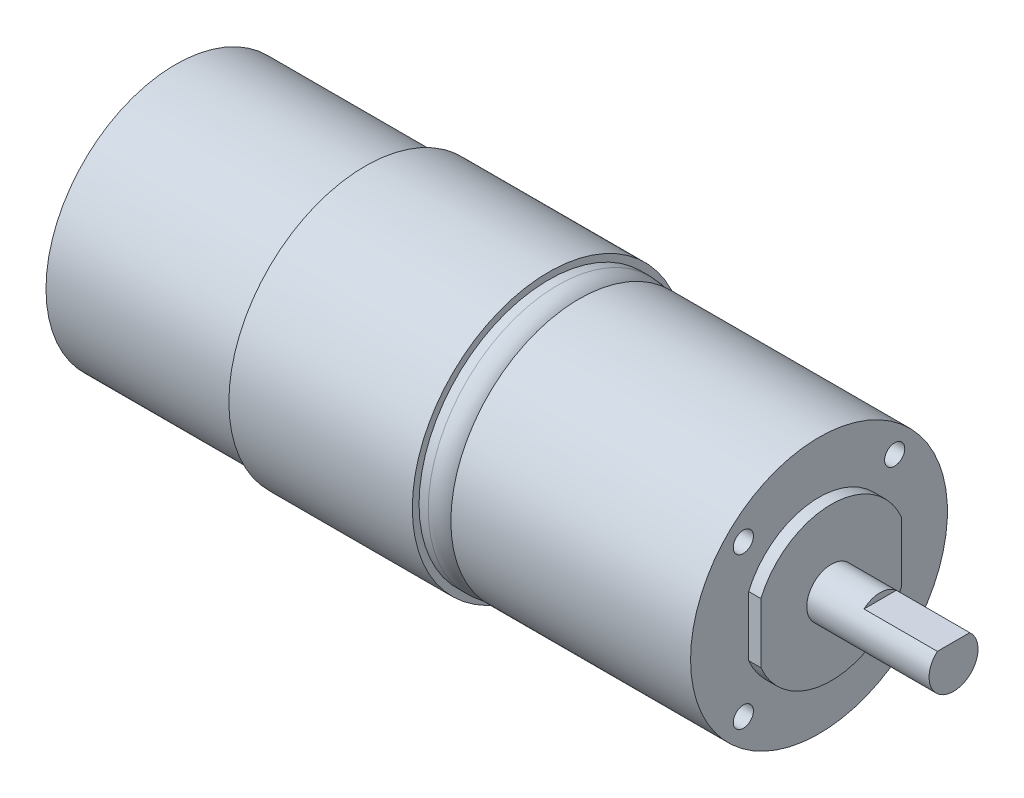
ISO-10303-21;
HEADER;
FILE_DESCRIPTION(('STEP AP214'),'2;1');
FILE_NAME('part.step','',(''),(''),'','','');
FILE_SCHEMA(('AUTOMOTIVE_DESIGN { 1 0 10303 214 1 1 1 1 }'));
ENDSEC;
DATA;
#1=APPLICATION_CONTEXT('core data for automotive mechanical design processes');
#2=APPLICATION_PROTOCOL_DEFINITION('international standard','automotive_design',2000,#1);
#3=PRODUCT_CONTEXT('',#1,'mechanical');
#4=PRODUCT('Part','Part','',(#3));
#5=PRODUCT_RELATED_PRODUCT_CATEGORY('part','',(#4));
#6=PRODUCT_DEFINITION_FORMATION('','',#4);
#7=PRODUCT_DEFINITION_CONTEXT('part definition',#1,'design');
#8=PRODUCT_DEFINITION('design','',#6,#7);
#9=PRODUCT_DEFINITION_SHAPE('','',#8);
#10=(LENGTH_UNIT() NAMED_UNIT(*) SI_UNIT(.MILLI.,.METRE.));
#11=(NAMED_UNIT(*) PLANE_ANGLE_UNIT() SI_UNIT($,.RADIAN.));
#12=(NAMED_UNIT(*) SI_UNIT($,.STERADIAN.) SOLID_ANGLE_UNIT());
#13=UNCERTAINTY_MEASURE_WITH_UNIT(LENGTH_MEASURE(1.E-05),#10,'distance_accuracy_value','');
#14=(GEOMETRIC_REPRESENTATION_CONTEXT(3) GLOBAL_UNCERTAINTY_ASSIGNED_CONTEXT((#13)) GLOBAL_UNIT_ASSIGNED_CONTEXT((#10,
#11,#12)) REPRESENTATION_CONTEXT('',''));
#15=CARTESIAN_POINT('',(0.,0.,0.));
#16=DIRECTION('',(0.,0.,1.));
#17=DIRECTION('',(1.,0.,0.));
#18=AXIS2_PLACEMENT_3D('',#15,#16,#17);
#19=CARTESIAN_POINT('',(-107.2,0.,0.));
#20=DIRECTION('',(1.,0.,0.));
#21=DIRECTION('',(0.,0.,-1.));
#22=AXIS2_PLACEMENT_3D('',#19,#20,#21);
#23=CYLINDRICAL_SURFACE('',#22,21.2);
#24=CARTESIAN_POINT('',(-44.7,0.,0.));
#25=DIRECTION('',(-1.,0.,0.));
#26=DIRECTION('',(0.,0.,1.));
#27=AXIS2_PLACEMENT_3D('',#24,#25,#26);
#28=CIRCLE('',#27,21.2);
#29=CARTESIAN_POINT('',(-44.7,0.,21.2));
#30=VERTEX_POINT('',#29);
#31=EDGE_CURVE('E61',#30,#30,#28,.T.);
#32=ORIENTED_EDGE('',*,*,#31,.T.);
#33=EDGE_LOOP('',(#32));
#34=FACE_BOUND('',#33,.T.);
#35=CARTESIAN_POINT('',(-46.2,0.,0.));
#36=DIRECTION('',(-1.,0.,0.));
#37=DIRECTION('',(0.,0.,1.));
#38=AXIS2_PLACEMENT_3D('',#35,#36,#37);
#39=CIRCLE('',#38,21.2);
#40=CARTESIAN_POINT('',(-46.2,0.,21.2));
#41=VERTEX_POINT('',#40);
#42=EDGE_CURVE('E12',#41,#41,#39,.T.);
#43=ORIENTED_EDGE('',*,*,#42,.F.);
#44=EDGE_LOOP('',(#43));
#45=FACE_BOUND('',#44,.T.);
#46=ADVANCED_FACE('F49',(#34,#45),#23,.T.);
#47=CARTESIAN_POINT('',(-41.2,0.,0.));
#48=DIRECTION('',(-1.,0.,0.));
#49=DIRECTION('',(0.,0.,1.));
#50=AXIS2_PLACEMENT_3D('',#47,#48,#49);
#51=PLANE('',#50);
#52=CARTESIAN_POINT('',(-41.2,0.,0.));
#53=DIRECTION('',(-1.,0.,0.));
#54=DIRECTION('',(0.,0.,1.));
#55=AXIS2_PLACEMENT_3D('',#52,#53,#54);
#56=CIRCLE('',#55,17.7);
#57=CARTESIAN_POINT('',(-41.2,0.,17.7));
#58=VERTEX_POINT('',#57);
#59=EDGE_CURVE('E57',#58,#58,#56,.F.);
#60=ORIENTED_EDGE('',*,*,#59,.T.);
#61=EDGE_LOOP('',(#60));
#62=FACE_BOUND('',#61,.T.);
#63=ADVANCED_FACE('F93',(#62),#51,.F.);
#64=CARTESIAN_POINT('',(-44.7,0.,0.));
#65=DIRECTION('',(-1.,0.,0.));
#66=DIRECTION('',(0.,0.,1.));
#67=AXIS2_PLACEMENT_3D('',#64,#65,#66);
#68=TOROIDAL_SURFACE('',#67,17.7,3.5);
#69=ORIENTED_EDGE('',*,*,#59,.F.);
#70=EDGE_LOOP('',(#69));
#71=FACE_BOUND('',#70,.T.);
#72=ORIENTED_EDGE('',*,*,#31,.F.);
#73=EDGE_LOOP('',(#72));
#74=FACE_BOUND('',#73,.T.);
#75=ADVANCED_FACE('F51',(#71,#74),#68,.T.);
#76=CARTESIAN_POINT('',(-76.2,0.,0.));
#77=DIRECTION('',(-1.,0.,0.));
#78=DIRECTION('',(0.,0.,1.));
#79=AXIS2_PLACEMENT_3D('',#76,#77,#78);
#80=PLANE('',#79);
#81=CARTESIAN_POINT('',(-76.2,0.,0.));
#82=DIRECTION('',(-1.,0.,0.));
#83=DIRECTION('',(0.,0.,1.));
#84=AXIS2_PLACEMENT_3D('',#81,#82,#83);
#85=CIRCLE('',#84,22.3);
#86=CARTESIAN_POINT('',(-76.2,0.,22.3));
#87=VERTEX_POINT('',#86);
#88=EDGE_CURVE('E72',#87,#87,#85,.T.);
#89=ORIENTED_EDGE('',*,*,#88,.T.);
#90=EDGE_LOOP('',(#89));
#91=FACE_BOUND('',#90,.T.);
#92=CARTESIAN_POINT('',(-76.2,0.,0.));
#93=DIRECTION('',(-1.,0.,0.));
#94=DIRECTION('',(0.,0.,1.));
#95=AXIS2_PLACEMENT_3D('',#92,#93,#94);
#96=CIRCLE('',#95,21.2);
#97=CARTESIAN_POINT('',(-76.2,0.,21.2));
#98=VERTEX_POINT('',#97);
#99=EDGE_CURVE('E53',#98,#98,#96,.T.);
#100=ORIENTED_EDGE('',*,*,#99,.F.);
#101=EDGE_LOOP('',(#100));
#102=FACE_BOUND('',#101,.T.);
#103=ADVANCED_FACE('F82',(#91,#102),#80,.T.);
#104=CARTESIAN_POINT('',(-46.2,0.,0.));
#105=DIRECTION('',(-1.,0.,0.));
#106=DIRECTION('',(0.,0.,1.));
#107=AXIS2_PLACEMENT_3D('',#104,#105,#106);
#108=PLANE('',#107);
#109=CARTESIAN_POINT('',(-46.2,0.,0.));
#110=DIRECTION('',(-1.,0.,0.));
#111=DIRECTION('',(0.,0.,1.));
#112=AXIS2_PLACEMENT_3D('',#109,#110,#111);
#113=CIRCLE('',#112,22.3);
#114=CARTESIAN_POINT('',(-46.2,0.,22.3));
#115=VERTEX_POINT('',#114);
#116=EDGE_CURVE('E69',#115,#115,#113,.T.);
#117=ORIENTED_EDGE('',*,*,#116,.F.);
#118=EDGE_LOOP('',(#117));
#119=FACE_BOUND('',#118,.T.);
#120=ORIENTED_EDGE('',*,*,#42,.T.);
#121=EDGE_LOOP('',(#120));
#122=FACE_BOUND('',#121,.T.);
#123=ADVANCED_FACE('F84',(#119,#122),#108,.F.);
#124=CARTESIAN_POINT('',(-76.2,0.,0.));
#125=DIRECTION('',(1.,0.,0.));
#126=DIRECTION('',(0.,0.,-1.));
#127=AXIS2_PLACEMENT_3D('',#124,#125,#126);
#128=CYLINDRICAL_SURFACE('',#127,22.3);
#129=ORIENTED_EDGE('',*,*,#88,.F.);
#130=EDGE_LOOP('',(#129));
#131=FACE_BOUND('',#130,.T.);
#132=ORIENTED_EDGE('',*,*,#116,.T.);
#133=EDGE_LOOP('',(#132));
#134=FACE_BOUND('',#133,.T.);
#135=ADVANCED_FACE('F90',(#131,#134),#128,.T.);
#136=CARTESIAN_POINT('',(-107.2,0.,0.));
#137=DIRECTION('',(-1.,0.,0.));
#138=DIRECTION('',(0.,0.,1.));
#139=AXIS2_PLACEMENT_3D('',#136,#137,#138);
#140=PLANE('',#139);
#141=CARTESIAN_POINT('',(-107.2,0.,0.));
#142=DIRECTION('',(-1.,0.,0.));
#143=DIRECTION('',(0.,0.,1.));
#144=AXIS2_PLACEMENT_3D('',#141,#142,#143);
#145=CIRCLE('',#144,21.2);
#146=CARTESIAN_POINT('',(-107.2,0.,21.2));
#147=VERTEX_POINT('',#146);
#148=EDGE_CURVE('E66',#147,#147,#145,.T.);
#149=ORIENTED_EDGE('',*,*,#148,.T.);
#150=EDGE_LOOP('',(#149));
#151=FACE_BOUND('',#150,.T.);
#152=ADVANCED_FACE('F104',(#151),#140,.T.);
#153=ORIENTED_EDGE('',*,*,#99,.T.);
#154=EDGE_LOOP('',(#153));
#155=FACE_BOUND('',#154,.T.);
#156=ORIENTED_EDGE('',*,*,#148,.F.);
#157=EDGE_LOOP('',(#156));
#158=FACE_BOUND('',#157,.T.);
#159=ADVANCED_FACE('F79',(#155,#158),#23,.T.);
#160=CLOSED_SHELL('',(#46,#63,#75,#103,#123,#135,#152,#159));
#161=MANIFOLD_SOLID_BREP('B2',#160);
#162=CARTESIAN_POINT('',(0.,0.,0.));
#163=DIRECTION('',(1.,0.,0.));
#164=DIRECTION('',(0.,0.,-1.));
#165=AXIS2_PLACEMENT_3D('',#162,#163,#164);
#166=PLANE('',#165);
#167=CARTESIAN_POINT('',(0.,0.,0.));
#168=DIRECTION('',(1.,0.,0.));
#169=DIRECTION('',(0.,0.,-1.));
#170=AXIS2_PLACEMENT_3D('',#167,#168,#169);
#171=CIRCLE('',#170,4.);
#172=CARTESIAN_POINT('',(0.,0.,-4.));
#173=VERTEX_POINT('',#172);
#174=EDGE_CURVE('E297',#173,#173,#171,.T.);
#175=ORIENTED_EDGE('',*,*,#174,.F.);
#176=EDGE_LOOP('',(#175));
#177=FACE_BOUND('',#176,.T.);
#178=CARTESIAN_POINT('',(0.,0.,0.));
#179=DIRECTION('',(1.,0.,0.));
#180=DIRECTION('',(0.,0.,-1.));
#181=AXIS2_PLACEMENT_3D('',#178,#179,#180);
#182=CIRCLE('',#181,12.5);
#183=CARTESIAN_POINT('',(0.,4.89897948556636,-11.5));
#184=VERTEX_POINT('',#183);
#185=CARTESIAN_POINT('',(0.,4.89897948556636,11.5));
#186=VERTEX_POINT('',#185);
#187=EDGE_CURVE('E171',#184,#186,#182,.T.);
#188=ORIENTED_EDGE('',*,*,#187,.T.);
#189=DIRECTION('',(0.,-1.,0.));
#190=VECTOR('',#189,1.);
#191=CARTESIAN_POINT('',(0.,-12.5,11.5));
#192=LINE('',#191,#190);
#193=CARTESIAN_POINT('',(0.,-4.89897948556636,11.5));
#194=VERTEX_POINT('',#193);
#195=EDGE_CURVE('E256',#186,#194,#192,.T.);
#196=ORIENTED_EDGE('',*,*,#195,.T.);
#197=CARTESIAN_POINT('',(0.,-4.89897948556636,-11.5));
#198=VERTEX_POINT('',#197);
#199=EDGE_CURVE('E242',#194,#198,#182,.T.);
#200=ORIENTED_EDGE('',*,*,#199,.T.);
#201=DIRECTION('',(0.,1.,0.));
#202=VECTOR('',#201,1.);
#203=CARTESIAN_POINT('',(0.,-12.5,-11.5));
#204=LINE('',#203,#202);
#205=EDGE_CURVE('E238',#198,#184,#204,.T.);
#206=ORIENTED_EDGE('',*,*,#205,.T.);
#207=EDGE_LOOP('',(#188,#196,#200,#206));
#208=FACE_BOUND('',#207,.T.);
#209=ADVANCED_FACE('F163',(#177,#208),#166,.T.);
#210=CARTESIAN_POINT('',(-2.,0.,0.));
#211=DIRECTION('',(1.,0.,0.));
#212=DIRECTION('',(0.,0.,-1.));
#213=AXIS2_PLACEMENT_3D('',#210,#211,#212);
#214=CYLINDRICAL_SURFACE('',#213,12.5);
#215=CARTESIAN_POINT('',(-2.,0.,0.));
#216=DIRECTION('',(-1.,0.,0.));
#217=DIRECTION('',(0.,0.,1.));
#218=AXIS2_PLACEMENT_3D('',#215,#216,#217);
#219=CIRCLE('',#218,12.5);
#220=CARTESIAN_POINT('',(-2.,4.89897948556636,-11.5));
#221=VERTEX_POINT('',#220);
#222=CARTESIAN_POINT('',(-2.,4.89897948556636,11.5));
#223=VERTEX_POINT('',#222);
#224=EDGE_CURVE('E178',#221,#223,#219,.F.);
#225=ORIENTED_EDGE('',*,*,#224,.T.);
#226=DIRECTION('',(1.,0.,0.));
#227=VECTOR('',#226,1.);
#228=CARTESIAN_POINT('',(-2.,4.89897948556636,11.5));
#229=LINE('',#228,#227);
#230=EDGE_CURVE('E235',#223,#186,#229,.T.);
#231=ORIENTED_EDGE('',*,*,#230,.T.);
#232=ORIENTED_EDGE('',*,*,#187,.F.);
#233=DIRECTION('',(1.,0.,0.));
#234=VECTOR('',#233,1.);
#235=CARTESIAN_POINT('',(-2.,4.89897948556636,-11.5));
#236=LINE('',#235,#234);
#237=EDGE_CURVE('E259',#184,#221,#236,.F.);
#238=ORIENTED_EDGE('',*,*,#237,.T.);
#239=EDGE_LOOP('',(#225,#231,#232,#238));
#240=FACE_BOUND('',#239,.T.);
#241=ADVANCED_FACE('F165',(#240),#214,.T.);
#242=CARTESIAN_POINT('',(-2.,-4.89897948556636,11.5));
#243=VERTEX_POINT('',#242);
#244=CARTESIAN_POINT('',(-2.,-4.89897948556636,-11.5));
#245=VERTEX_POINT('',#244);
#246=EDGE_CURVE('E186',#243,#245,#219,.F.);
#247=ORIENTED_EDGE('',*,*,#246,.T.);
#248=DIRECTION('',(1.,0.,0.));
#249=VECTOR('',#248,1.);
#250=CARTESIAN_POINT('',(-2.,-4.89897948556636,-11.5));
#251=LINE('',#250,#249);
#252=EDGE_CURVE('E261',#245,#198,#251,.T.);
#253=ORIENTED_EDGE('',*,*,#252,.T.);
#254=ORIENTED_EDGE('',*,*,#199,.F.);
#255=DIRECTION('',(1.,0.,0.));
#256=VECTOR('',#255,1.);
#257=CARTESIAN_POINT('',(-2.,-4.89897948556636,11.5));
#258=LINE('',#257,#256);
#259=EDGE_CURVE('E233',#194,#243,#258,.F.);
#260=ORIENTED_EDGE('',*,*,#259,.T.);
#261=EDGE_LOOP('',(#247,#253,#254,#260));
#262=FACE_BOUND('',#261,.T.);
#263=ADVANCED_FACE('F241',(#262),#214,.T.);
#264=CARTESIAN_POINT('',(-41.2,0.,0.));
#265=DIRECTION('',(1.,0.,0.));
#266=DIRECTION('',(0.,0.,-1.));
#267=AXIS2_PLACEMENT_3D('',#264,#265,#266);
#268=CYLINDRICAL_SURFACE('',#267,21.);
#269=CARTESIAN_POINT('',(-41.2,0.,0.));
#270=DIRECTION('',(-1.,0.,0.));
#271=DIRECTION('',(0.,0.,1.));
#272=AXIS2_PLACEMENT_3D('',#269,#270,#271);
#273=CIRCLE('',#272,21.);
#274=CARTESIAN_POINT('',(-41.2,0.,21.));
#275=VERTEX_POINT('',#274);
#276=EDGE_CURVE('E249',#275,#275,#273,.T.);
#277=ORIENTED_EDGE('',*,*,#276,.F.);
#278=EDGE_LOOP('',(#277));
#279=FACE_BOUND('',#278,.T.);
#280=CARTESIAN_POINT('',(-2.,0.,0.));
#281=DIRECTION('',(-1.,0.,0.));
#282=DIRECTION('',(0.,0.,1.));
#283=AXIS2_PLACEMENT_3D('',#280,#281,#282);
#284=CIRCLE('',#283,21.);
#285=CARTESIAN_POINT('',(-2.,0.,21.));
#286=VERTEX_POINT('',#285);
#287=EDGE_CURVE('E251',#286,#286,#284,.T.);
#288=ORIENTED_EDGE('',*,*,#287,.T.);
#289=EDGE_LOOP('',(#288));
#290=FACE_BOUND('',#289,.T.);
#291=ADVANCED_FACE('F309',(#279,#290),#268,.T.);
#292=CARTESIAN_POINT('',(-41.2,0.,0.));
#293=DIRECTION('',(-1.,0.,0.));
#294=DIRECTION('',(0.,0.,1.));
#295=AXIS2_PLACEMENT_3D('',#292,#293,#294);
#296=PLANE('',#295);
#297=ORIENTED_EDGE('',*,*,#276,.T.);
#298=EDGE_LOOP('',(#297));
#299=FACE_BOUND('',#298,.T.);
#300=ADVANCED_FACE('F313',(#299),#296,.T.);
#301=CARTESIAN_POINT('',(-2.,0.,0.));
#302=DIRECTION('',(-1.,0.,0.));
#303=DIRECTION('',(0.,0.,1.));
#304=AXIS2_PLACEMENT_3D('',#301,#302,#303);
#305=PLANE('',#304);
#306=ORIENTED_EDGE('',*,*,#246,.F.);
#307=DIRECTION('',(0.,-1.,0.));
#308=VECTOR('',#307,1.);
#309=CARTESIAN_POINT('',(-2.,-12.5,11.5));
#310=LINE('',#309,#308);
#311=EDGE_CURVE('E230',#223,#243,#310,.T.);
#312=ORIENTED_EDGE('',*,*,#311,.F.);
#313=ORIENTED_EDGE('',*,*,#224,.F.);
#314=DIRECTION('',(0.,1.,0.));
#315=VECTOR('',#314,1.);
#316=CARTESIAN_POINT('',(-2.,-12.5,-11.5));
#317=LINE('',#316,#315);
#318=EDGE_CURVE('E237',#245,#221,#317,.T.);
#319=ORIENTED_EDGE('',*,*,#318,.F.);
#320=EDGE_LOOP('',(#306,#312,#313,#319));
#321=FACE_BOUND('',#320,.T.);
#322=CARTESIAN_POINT('',(-2.,12.3743686707646,12.3743686707646));
#323=DIRECTION('',(1.,0.,0.));
#324=DIRECTION('',(0.,0.,-1.));
#325=AXIS2_PLACEMENT_3D('',#322,#323,#324);
#326=CIRCLE('',#325,1.65);
#327=CARTESIAN_POINT('',(-2.,12.3743686707646,10.7243686707646));
#328=VERTEX_POINT('',#327);
#329=EDGE_CURVE('E243',#328,#328,#326,.T.);
#330=ORIENTED_EDGE('',*,*,#329,.F.);
#331=EDGE_LOOP('',(#330));
#332=FACE_BOUND('',#331,.T.);
#333=CARTESIAN_POINT('',(-2.,12.3743686707646,-12.3743686707646));
#334=DIRECTION('',(1.,0.,0.));
#335=DIRECTION('',(0.,0.,-1.));
#336=AXIS2_PLACEMENT_3D('',#333,#334,#335);
#337=CIRCLE('',#336,1.65);
#338=CARTESIAN_POINT('',(-2.,12.3743686707646,-14.0243686707646));
#339=VERTEX_POINT('',#338);
#340=EDGE_CURVE('E270',#339,#339,#337,.T.);
#341=ORIENTED_EDGE('',*,*,#340,.F.);
#342=EDGE_LOOP('',(#341));
#343=FACE_BOUND('',#342,.T.);
#344=CARTESIAN_POINT('',(-2.,-12.3743686707646,-12.3743686707646));
#345=DIRECTION('',(1.,0.,0.));
#346=DIRECTION('',(0.,0.,-1.));
#347=AXIS2_PLACEMENT_3D('',#344,#345,#346);
#348=CIRCLE('',#347,1.65);
#349=CARTESIAN_POINT('',(-2.,-12.3743686707646,-14.0243686707646));
#350=VERTEX_POINT('',#349);
#351=EDGE_CURVE('E276',#350,#350,#348,.T.);
#352=ORIENTED_EDGE('',*,*,#351,.F.);
#353=EDGE_LOOP('',(#352));
#354=FACE_BOUND('',#353,.T.);
#355=CARTESIAN_POINT('',(-2.,-12.3743686707646,12.3743686707646));
#356=DIRECTION('',(1.,0.,0.));
#357=DIRECTION('',(0.,0.,-1.));
#358=AXIS2_PLACEMENT_3D('',#355,#356,#357);
#359=CIRCLE('',#358,1.65);
#360=CARTESIAN_POINT('',(-2.,-12.3743686707646,10.7243686707646));
#361=VERTEX_POINT('',#360);
#362=EDGE_CURVE('E282',#361,#361,#359,.T.);
#363=ORIENTED_EDGE('',*,*,#362,.F.);
#364=EDGE_LOOP('',(#363));
#365=FACE_BOUND('',#364,.T.);
#366=ORIENTED_EDGE('',*,*,#287,.F.);
#367=EDGE_LOOP('',(#366));
#368=FACE_BOUND('',#367,.T.);
#369=ADVANCED_FACE('F245',(#321,#332,#343,#354,#365,#368),#305,.F.);
#370=CARTESIAN_POINT('',(20.,0.,0.));
#371=DIRECTION('',(-1.,0.,0.));
#372=DIRECTION('',(0.,0.,1.));
#373=AXIS2_PLACEMENT_3D('',#370,#371,#372);
#374=CYLINDRICAL_SURFACE('',#373,4.);
#375=CARTESIAN_POINT('',(8.,0.,0.));
#376=DIRECTION('',(1.,0.,0.));
#377=DIRECTION('',(0.,0.,-1.));
#378=AXIS2_PLACEMENT_3D('',#375,#376,#377);
#379=CIRCLE('',#378,4.);
#380=CARTESIAN_POINT('',(8.,3.,-2.64575131106459));
#381=VERTEX_POINT('',#380);
#382=CARTESIAN_POINT('',(8.,3.,2.64575131106459));
#383=VERTEX_POINT('',#382);
#384=EDGE_CURVE('E47',#381,#383,#379,.T.);
#385=ORIENTED_EDGE('',*,*,#384,.F.);
#386=DIRECTION('',(1.,0.,0.));
#387=VECTOR('',#386,1.);
#388=CARTESIAN_POINT('',(8.,3.,-2.64575131106459));
#389=LINE('',#388,#387);
#390=CARTESIAN_POINT('',(20.,3.,-2.64575131106459));
#391=VERTEX_POINT('',#390);
#392=EDGE_CURVE('E294',#381,#391,#389,.T.);
#393=ORIENTED_EDGE('',*,*,#392,.T.);
#394=CARTESIAN_POINT('',(20.,0.,0.));
#395=DIRECTION('',(1.,0.,0.));
#396=DIRECTION('',(0.,0.,-1.));
#397=AXIS2_PLACEMENT_3D('',#394,#395,#396);
#398=CIRCLE('',#397,4.);
#399=CARTESIAN_POINT('',(20.,3.,2.64575131106459));
#400=VERTEX_POINT('',#399);
#401=EDGE_CURVE('E299',#400,#391,#398,.T.);
#402=ORIENTED_EDGE('',*,*,#401,.F.);
#403=DIRECTION('',(1.,0.,0.));
#404=VECTOR('',#403,1.);
#405=CARTESIAN_POINT('',(8.,3.,2.64575131106459));
#406=LINE('',#405,#404);
#407=EDGE_CURVE('E292',#383,#400,#406,.T.);
#408=ORIENTED_EDGE('',*,*,#407,.F.);
#409=EDGE_LOOP('',(#385,#393,#402,#408));
#410=FACE_BOUND('',#409,.T.);
#411=ORIENTED_EDGE('',*,*,#174,.T.);
#412=EDGE_LOOP('',(#411));
#413=FACE_BOUND('',#412,.T.);
#414=ADVANCED_FACE('F312',(#410,#413),#374,.T.);
#415=CARTESIAN_POINT('',(20.,0.,0.));
#416=DIRECTION('',(1.,0.,0.));
#417=DIRECTION('',(0.,0.,-1.));
#418=AXIS2_PLACEMENT_3D('',#415,#416,#417);
#419=PLANE('',#418);
#420=DIRECTION('',(0.,0.,-1.));
#421=VECTOR('',#420,1.);
#422=CARTESIAN_POINT('',(20.,3.,2.64575131106459));
#423=LINE('',#422,#421);
#424=EDGE_CURVE('E288',#400,#391,#423,.T.);
#425=ORIENTED_EDGE('',*,*,#424,.F.);
#426=ORIENTED_EDGE('',*,*,#401,.T.);
#427=EDGE_LOOP('',(#425,#426));
#428=FACE_BOUND('',#427,.T.);
#429=ADVANCED_FACE('F320',(#428),#419,.T.);
#430=CARTESIAN_POINT('',(8.,0.,0.));
#431=DIRECTION('',(1.,0.,0.));
#432=DIRECTION('',(0.,0.,-1.));
#433=AXIS2_PLACEMENT_3D('',#430,#431,#432);
#434=PLANE('',#433);
#435=ORIENTED_EDGE('',*,*,#384,.T.);
#436=DIRECTION('',(0.,0.,-1.));
#437=VECTOR('',#436,1.);
#438=CARTESIAN_POINT('',(8.,3.,2.64575131106459));
#439=LINE('',#438,#437);
#440=EDGE_CURVE('E289',#383,#381,#439,.T.);
#441=ORIENTED_EDGE('',*,*,#440,.T.);
#442=EDGE_LOOP('',(#435,#441));
#443=FACE_BOUND('',#442,.T.);
#444=ADVANCED_FACE('F426',(#443),#434,.T.);
#445=CARTESIAN_POINT('',(8.,3.,2.64575131106459));
#446=DIRECTION('',(0.,-1.,0.));
#447=DIRECTION('',(0.,0.,-1.));
#448=AXIS2_PLACEMENT_3D('',#445,#446,#447);
#449=PLANE('',#448);
#450=ORIENTED_EDGE('',*,*,#424,.T.);
#451=ORIENTED_EDGE('',*,*,#392,.F.);
#452=ORIENTED_EDGE('',*,*,#440,.F.);
#453=ORIENTED_EDGE('',*,*,#407,.T.);
#454=EDGE_LOOP('',(#450,#451,#452,#453));
#455=FACE_BOUND('',#454,.T.);
#456=ADVANCED_FACE('F424',(#455),#449,.F.);
#457=CARTESIAN_POINT('',(-12.1,-12.3743686707646,12.3743686707646));
#458=DIRECTION('',(1.,0.,0.));
#459=DIRECTION('',(0.,0.,-1.));
#460=AXIS2_PLACEMENT_3D('',#457,#458,#459);
#461=CONICAL_SURFACE('',#460,1.65,1.02974425867665);
#462=CARTESIAN_POINT('',(-13.0914200213955,-12.3743686707646,12.3743686707646));
#463=VERTEX_POINT('',#462);
#464=VERTEX_LOOP('',#463);
#465=FACE_BOUND('',#464,.T.);
#466=CARTESIAN_POINT('',(-12.1,-12.3743686707646,12.3743686707646));
#467=DIRECTION('',(1.,0.,0.));
#468=DIRECTION('',(0.,0.,-1.));
#469=AXIS2_PLACEMENT_3D('',#466,#467,#468);
#470=CIRCLE('',#469,1.65);
#471=CARTESIAN_POINT('',(-12.1,-12.3743686707646,10.7243686707646));
#472=VERTEX_POINT('',#471);
#473=EDGE_CURVE('E285',#472,#472,#470,.T.);
#474=ORIENTED_EDGE('',*,*,#473,.T.);
#475=EDGE_LOOP('',(#474));
#476=FACE_BOUND('',#475,.T.);
#477=ADVANCED_FACE('F359',(#465,#476),#461,.F.);
#478=CARTESIAN_POINT('',(-2.,-12.3743686707646,12.3743686707646));
#479=DIRECTION('',(1.,0.,0.));
#480=DIRECTION('',(0.,0.,-1.));
#481=AXIS2_PLACEMENT_3D('',#478,#479,#480);
#482=CYLINDRICAL_SURFACE('',#481,1.65);
#483=ORIENTED_EDGE('',*,*,#473,.F.);
#484=EDGE_LOOP('',(#483));
#485=FACE_BOUND('',#484,.T.);
#486=ORIENTED_EDGE('',*,*,#362,.T.);
#487=EDGE_LOOP('',(#486));
#488=FACE_BOUND('',#487,.T.);
#489=ADVANCED_FACE('F353',(#485,#488),#482,.F.);
#490=CARTESIAN_POINT('',(-12.1,-12.3743686707646,-12.3743686707646));
#491=DIRECTION('',(1.,0.,0.));
#492=DIRECTION('',(0.,0.,-1.));
#493=AXIS2_PLACEMENT_3D('',#490,#491,#492);
#494=CONICAL_SURFACE('',#493,1.65,1.02974425867665);
#495=CARTESIAN_POINT('',(-13.0914200213955,-12.3743686707646,-12.3743686707646));
#496=VERTEX_POINT('',#495);
#497=VERTEX_LOOP('',#496);
#498=FACE_BOUND('',#497,.T.);
#499=CARTESIAN_POINT('',(-12.1,-12.3743686707646,-12.3743686707646));
#500=DIRECTION('',(1.,0.,0.));
#501=DIRECTION('',(0.,0.,-1.));
#502=AXIS2_PLACEMENT_3D('',#499,#500,#501);
#503=CIRCLE('',#502,1.65);
#504=CARTESIAN_POINT('',(-12.1,-12.3743686707646,-14.0243686707646));
#505=VERTEX_POINT('',#504);
#506=EDGE_CURVE('E279',#505,#505,#503,.T.);
#507=ORIENTED_EDGE('',*,*,#506,.T.);
#508=EDGE_LOOP('',(#507));
#509=FACE_BOUND('',#508,.T.);
#510=ADVANCED_FACE('F358',(#498,#509),#494,.F.);
#511=CARTESIAN_POINT('',(-2.,-12.3743686707646,-12.3743686707646));
#512=DIRECTION('',(1.,0.,0.));
#513=DIRECTION('',(0.,0.,-1.));
#514=AXIS2_PLACEMENT_3D('',#511,#512,#513);
#515=CYLINDRICAL_SURFACE('',#514,1.65);
#516=ORIENTED_EDGE('',*,*,#506,.F.);
#517=EDGE_LOOP('',(#516));
#518=FACE_BOUND('',#517,.T.);
#519=ORIENTED_EDGE('',*,*,#351,.T.);
#520=EDGE_LOOP('',(#519));
#521=FACE_BOUND('',#520,.T.);
#522=ADVANCED_FACE('F367',(#518,#521),#515,.F.);
#523=CARTESIAN_POINT('',(-12.1,12.3743686707646,-12.3743686707646));
#524=DIRECTION('',(1.,0.,0.));
#525=DIRECTION('',(0.,0.,-1.));
#526=AXIS2_PLACEMENT_3D('',#523,#524,#525);
#527=CONICAL_SURFACE('',#526,1.65,1.02974425867665);
#528=CARTESIAN_POINT('',(-13.0914200213955,12.3743686707646,-12.3743686707646));
#529=VERTEX_POINT('',#528);
#530=VERTEX_LOOP('',#529);
#531=FACE_BOUND('',#530,.T.);
#532=CARTESIAN_POINT('',(-12.1,12.3743686707646,-12.3743686707646));
#533=DIRECTION('',(1.,0.,0.));
#534=DIRECTION('',(0.,0.,-1.));
#535=AXIS2_PLACEMENT_3D('',#532,#533,#534);
#536=CIRCLE('',#535,1.65);
#537=CARTESIAN_POINT('',(-12.1,12.3743686707646,-14.0243686707646));
#538=VERTEX_POINT('',#537);
#539=EDGE_CURVE('E273',#538,#538,#536,.T.);
#540=ORIENTED_EDGE('',*,*,#539,.T.);
#541=EDGE_LOOP('',(#540));
#542=FACE_BOUND('',#541,.T.);
#543=ADVANCED_FACE('F371',(#531,#542),#527,.F.);
#544=CARTESIAN_POINT('',(-2.,12.3743686707646,-12.3743686707646));
#545=DIRECTION('',(1.,0.,0.));
#546=DIRECTION('',(0.,0.,-1.));
#547=AXIS2_PLACEMENT_3D('',#544,#545,#546);
#548=CYLINDRICAL_SURFACE('',#547,1.65);
#549=ORIENTED_EDGE('',*,*,#539,.F.);
#550=EDGE_LOOP('',(#549));
#551=FACE_BOUND('',#550,.T.);
#552=ORIENTED_EDGE('',*,*,#340,.T.);
#553=EDGE_LOOP('',(#552));
#554=FACE_BOUND('',#553,.T.);
#555=ADVANCED_FACE('F379',(#551,#554),#548,.F.);
#556=CARTESIAN_POINT('',(-12.1,12.3743686707646,12.3743686707646));
#557=DIRECTION('',(1.,0.,0.));
#558=DIRECTION('',(0.,0.,-1.));
#559=AXIS2_PLACEMENT_3D('',#556,#557,#558);
#560=CONICAL_SURFACE('',#559,1.65,1.02974425867665);
#561=CARTESIAN_POINT('',(-13.0914200213955,12.3743686707646,12.3743686707646));
#562=VERTEX_POINT('',#561);
#563=VERTEX_LOOP('',#562);
#564=FACE_BOUND('',#563,.T.);
#565=CARTESIAN_POINT('',(-12.1,12.3743686707646,12.3743686707646));
#566=DIRECTION('',(1.,0.,0.));
#567=DIRECTION('',(0.,0.,-1.));
#568=AXIS2_PLACEMENT_3D('',#565,#566,#567);
#569=CIRCLE('',#568,1.65);
#570=CARTESIAN_POINT('',(-12.1,12.3743686707646,10.7243686707646));
#571=VERTEX_POINT('',#570);
#572=EDGE_CURVE('E267',#571,#571,#569,.T.);
#573=ORIENTED_EDGE('',*,*,#572,.T.);
#574=EDGE_LOOP('',(#573));
#575=FACE_BOUND('',#574,.T.);
#576=ADVANCED_FACE('F383',(#564,#575),#560,.F.);
#577=CARTESIAN_POINT('',(-2.,12.3743686707646,12.3743686707646));
#578=DIRECTION('',(1.,0.,0.));
#579=DIRECTION('',(0.,0.,-1.));
#580=AXIS2_PLACEMENT_3D('',#577,#578,#579);
#581=CYLINDRICAL_SURFACE('',#580,1.65);
#582=ORIENTED_EDGE('',*,*,#572,.F.);
#583=EDGE_LOOP('',(#582));
#584=FACE_BOUND('',#583,.T.);
#585=ORIENTED_EDGE('',*,*,#329,.T.);
#586=EDGE_LOOP('',(#585));
#587=FACE_BOUND('',#586,.T.);
#588=ADVANCED_FACE('F391',(#584,#587),#581,.F.);
#589=CARTESIAN_POINT('',(-71.0500938173507,-12.5,11.5));
#590=DIRECTION('',(0.,0.,1.));
#591=DIRECTION('',(1.,0.,0.));
#592=AXIS2_PLACEMENT_3D('',#589,#590,#591);
#593=PLANE('',#592);
#594=ORIENTED_EDGE('',*,*,#195,.F.);
#595=ORIENTED_EDGE('',*,*,#230,.F.);
#596=ORIENTED_EDGE('',*,*,#311,.T.);
#597=ORIENTED_EDGE('',*,*,#259,.F.);
#598=EDGE_LOOP('',(#594,#595,#596,#597));
#599=FACE_BOUND('',#598,.T.);
#600=ADVANCED_FACE('F232',(#599),#593,.T.);
#601=CARTESIAN_POINT('',(-71.0500938173507,-12.5,-11.5));
#602=DIRECTION('',(0.,0.,-1.));
#603=DIRECTION('',(-1.,0.,0.));
#604=AXIS2_PLACEMENT_3D('',#601,#602,#603);
#605=PLANE('',#604);
#606=ORIENTED_EDGE('',*,*,#205,.F.);
#607=ORIENTED_EDGE('',*,*,#252,.F.);
#608=ORIENTED_EDGE('',*,*,#318,.T.);
#609=ORIENTED_EDGE('',*,*,#237,.F.);
#610=EDGE_LOOP('',(#606,#607,#608,#609));
#611=FACE_BOUND('',#610,.T.);
#612=ADVANCED_FACE('F403',(#611),#605,.T.);
#613=CLOSED_SHELL('',(#209,#241,#263,#291,#300,#369,#414,#429,#444,#456,#477,#489,#510,#522,
#543,#555,#576,#588,#600,#612));
#614=MANIFOLD_SOLID_BREP('B7',#613);
#615=ADVANCED_BREP_SHAPE_REPRESENTATION('',(#18,#161,#614),#14);
#616=SHAPE_DEFINITION_REPRESENTATION(#9,#615);
ENDSEC;
END-ISO-10303-21;
